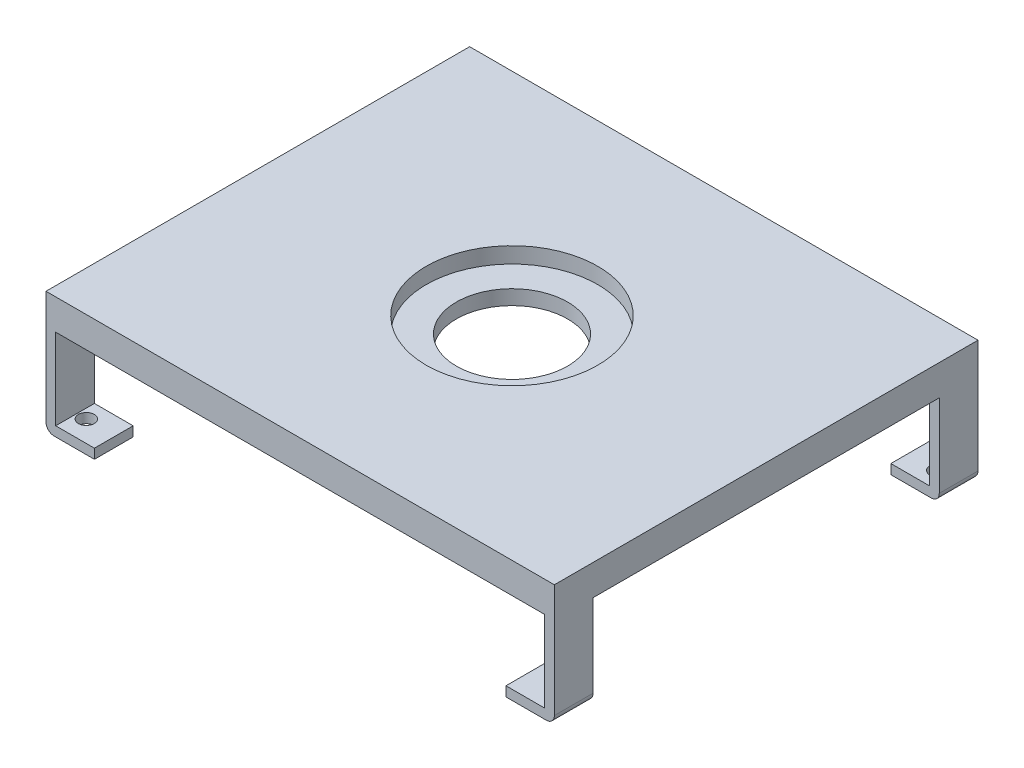
ISO-10303-21;
HEADER;
FILE_DESCRIPTION(('STEP AP214'),'2;1');
FILE_NAME('part.step','',(''),(''),'','','');
FILE_SCHEMA(('AUTOMOTIVE_DESIGN { 1 0 10303 214 1 1 1 1 }'));
ENDSEC;
DATA;
#1=APPLICATION_CONTEXT('core data for automotive mechanical design processes');
#2=APPLICATION_PROTOCOL_DEFINITION('international standard','automotive_design',2000,#1);
#3=PRODUCT_CONTEXT('',#1,'mechanical');
#4=PRODUCT('Part','Part','',(#3));
#5=PRODUCT_RELATED_PRODUCT_CATEGORY('part','',(#4));
#6=PRODUCT_DEFINITION_FORMATION('','',#4);
#7=PRODUCT_DEFINITION_CONTEXT('part definition',#1,'design');
#8=PRODUCT_DEFINITION('design','',#6,#7);
#9=PRODUCT_DEFINITION_SHAPE('','',#8);
#10=(LENGTH_UNIT() NAMED_UNIT(*) SI_UNIT(.MILLI.,.METRE.));
#11=(NAMED_UNIT(*) PLANE_ANGLE_UNIT() SI_UNIT($,.RADIAN.));
#12=(NAMED_UNIT(*) SI_UNIT($,.STERADIAN.) SOLID_ANGLE_UNIT());
#13=UNCERTAINTY_MEASURE_WITH_UNIT(LENGTH_MEASURE(1.E-05),#10,'distance_accuracy_value','');
#14=(GEOMETRIC_REPRESENTATION_CONTEXT(3) GLOBAL_UNCERTAINTY_ASSIGNED_CONTEXT((#13)) GLOBAL_UNIT_ASSIGNED_CONTEXT((#10,
#11,#12)) REPRESENTATION_CONTEXT('',''));
#15=CARTESIAN_POINT('',(0.,0.,0.));
#16=DIRECTION('',(0.,0.,1.));
#17=DIRECTION('',(1.,0.,0.));
#18=AXIS2_PLACEMENT_3D('',#15,#16,#17);
#19=CARTESIAN_POINT('',(0.,0.,66.675));
#20=DIRECTION('',(0.,1.,0.));
#21=DIRECTION('',(0.,0.,1.));
#22=AXIS2_PLACEMENT_3D('',#19,#20,#21);
#23=CYLINDRICAL_SURFACE('',#22,17.5);
#24=CARTESIAN_POINT('',(0.,28.58,66.675));
#25=DIRECTION('',(0.,1.,0.));
#26=DIRECTION('',(0.,0.,1.));
#27=AXIS2_PLACEMENT_3D('',#24,#25,#26);
#28=CIRCLE('',#27,17.5);
#29=CARTESIAN_POINT('',(0.,28.58,84.175));
#30=VERTEX_POINT('',#29);
#31=EDGE_CURVE('E248',#30,#30,#28,.T.);
#32=ORIENTED_EDGE('',*,*,#31,.F.);
#33=EDGE_LOOP('',(#32));
#34=FACE_BOUND('',#33,.T.);
#35=CARTESIAN_POINT('',(0.,33.2,66.675));
#36=DIRECTION('',(0.,1.,0.));
#37=DIRECTION('',(0.,0.,1.));
#38=AXIS2_PLACEMENT_3D('',#35,#36,#37);
#39=CIRCLE('',#38,17.5);
#40=CARTESIAN_POINT('',(0.,33.2,84.175));
#41=VERTEX_POINT('',#40);
#42=EDGE_CURVE('E944',#41,#41,#39,.T.);
#43=ORIENTED_EDGE('',*,*,#42,.T.);
#44=EDGE_LOOP('',(#43));
#45=FACE_BOUND('',#44,.T.);
#46=ADVANCED_FACE('F37',(#34,#45),#23,.F.);
#47=CARTESIAN_POINT('',(-64.77,3.048,133.35));
#48=DIRECTION('',(-1.,0.,0.));
#49=DIRECTION('',(0.,0.,1.));
#50=AXIS2_PLACEMENT_3D('',#47,#48,#49);
#51=PLANE('',#50);
#52=DIRECTION('',(0.,0.,-1.));
#53=VECTOR('',#52,1.);
#54=CARTESIAN_POINT('',(-64.77,3.048,133.35));
#55=LINE('',#54,#53);
#56=CARTESIAN_POINT('',(-64.77,3.048,12.192));
#57=VERTEX_POINT('',#56);
#58=CARTESIAN_POINT('',(-64.77,3.048,0.));
#59=VERTEX_POINT('',#58);
#60=EDGE_CURVE('E397',#57,#59,#55,.T.);
#61=ORIENTED_EDGE('',*,*,#60,.F.);
#62=DIRECTION('',(0.,-1.,0.));
#63=VECTOR('',#62,1.);
#64=CARTESIAN_POINT('',(-64.77,3.04800000000002,12.192));
#65=LINE('',#64,#63);
#66=CARTESIAN_POINT('',(-64.77,0.,12.192));
#67=VERTEX_POINT('',#66);
#68=EDGE_CURVE('E317',#57,#67,#65,.T.);
#69=ORIENTED_EDGE('',*,*,#68,.T.);
#70=DIRECTION('',(0.,0.,-1.));
#71=VECTOR('',#70,1.);
#72=CARTESIAN_POINT('',(-64.77,0.,133.35));
#73=LINE('',#72,#71);
#74=CARTESIAN_POINT('',(-64.77,0.,0.));
#75=VERTEX_POINT('',#74);
#76=EDGE_CURVE('E342',#67,#75,#73,.T.);
#77=ORIENTED_EDGE('',*,*,#76,.T.);
#78=DIRECTION('',(0.,1.,0.));
#79=VECTOR('',#78,1.);
#80=CARTESIAN_POINT('',(-64.77,3.048,0.));
#81=LINE('',#80,#79);
#82=EDGE_CURVE('E320',#75,#59,#81,.T.);
#83=ORIENTED_EDGE('',*,*,#82,.T.);
#84=EDGE_LOOP('',(#61,#69,#77,#83));
#85=FACE_BOUND('',#84,.T.);
#86=ADVANCED_FACE('F497',(#85),#51,.F.);
#87=CARTESIAN_POINT('',(-76.962,3.04799999999998,133.35));
#88=DIRECTION('',(0.,-1.,0.));
#89=DIRECTION('',(1.,0.,0.));
#90=AXIS2_PLACEMENT_3D('',#87,#88,#89);
#91=PLANE('',#90);
#92=CARTESIAN_POINT('',(-74.,3.04799999999999,6.67499999999998));
#93=DIRECTION('',(0.,-1.,0.));
#94=DIRECTION('',(1.,0.,0.));
#95=AXIS2_PLACEMENT_3D('',#92,#93,#94);
#96=CIRCLE('',#95,2.5);
#97=CARTESIAN_POINT('',(-71.5,3.04799999999999,6.67499999999998));
#98=VERTEX_POINT('',#97);
#99=EDGE_CURVE('E949',#98,#98,#96,.T.);
#100=ORIENTED_EDGE('',*,*,#99,.T.);
#101=EDGE_LOOP('',(#100));
#102=FACE_BOUND('',#101,.T.);
#103=DIRECTION('',(0.,0.,-1.));
#104=VECTOR('',#103,1.);
#105=CARTESIAN_POINT('',(-76.962,3.04799999999998,133.35));
#106=LINE('',#105,#104);
#107=CARTESIAN_POINT('',(-76.962,3.04799999999998,12.192));
#108=VERTEX_POINT('',#107);
#109=CARTESIAN_POINT('',(-76.962,3.04799999999998,0.));
#110=VERTEX_POINT('',#109);
#111=EDGE_CURVE('E393',#108,#110,#106,.T.);
#112=ORIENTED_EDGE('',*,*,#111,.F.);
#113=DIRECTION('',(1.,0.,0.));
#114=VECTOR('',#113,1.);
#115=CARTESIAN_POINT('',(-76.962,3.04799999999998,12.192));
#116=LINE('',#115,#114);
#117=EDGE_CURVE('E314',#108,#57,#116,.T.);
#118=ORIENTED_EDGE('',*,*,#117,.T.);
#119=ORIENTED_EDGE('',*,*,#60,.T.);
#120=DIRECTION('',(-1.,0.,0.));
#121=VECTOR('',#120,1.);
#122=CARTESIAN_POINT('',(-76.962,3.04799999999998,0.));
#123=LINE('',#122,#121);
#124=EDGE_CURVE('E345',#59,#110,#123,.T.);
#125=ORIENTED_EDGE('',*,*,#124,.T.);
#126=EDGE_LOOP('',(#112,#118,#119,#125));
#127=FACE_BOUND('',#126,.T.);
#128=ADVANCED_FACE('F503',(#102,#127),#91,.F.);
#129=CARTESIAN_POINT('',(-76.962,28.58,133.35));
#130=DIRECTION('',(-1.,0.,0.));
#131=DIRECTION('',(0.,0.,1.));
#132=AXIS2_PLACEMENT_3D('',#129,#130,#131);
#133=PLANE('',#132);
#134=DIRECTION('',(0.,0.,-1.));
#135=VECTOR('',#134,1.);
#136=CARTESIAN_POINT('',(-76.962,28.58,133.35));
#137=LINE('',#136,#135);
#138=CARTESIAN_POINT('',(-76.962,28.58,12.192));
#139=VERTEX_POINT('',#138);
#140=CARTESIAN_POINT('',(-76.962,28.58,0.));
#141=VERTEX_POINT('',#140);
#142=EDGE_CURVE('E389',#139,#141,#137,.T.);
#143=ORIENTED_EDGE('',*,*,#142,.F.);
#144=DIRECTION('',(0.,-1.,0.));
#145=VECTOR('',#144,1.);
#146=CARTESIAN_POINT('',(-76.962,28.58,12.192));
#147=LINE('',#146,#145);
#148=EDGE_CURVE('E311',#139,#108,#147,.T.);
#149=ORIENTED_EDGE('',*,*,#148,.T.);
#150=ORIENTED_EDGE('',*,*,#111,.T.);
#151=DIRECTION('',(0.,1.,0.));
#152=VECTOR('',#151,1.);
#153=CARTESIAN_POINT('',(-76.962,28.58,0.));
#154=LINE('',#153,#152);
#155=EDGE_CURVE('E348',#110,#141,#154,.T.);
#156=ORIENTED_EDGE('',*,*,#155,.T.);
#157=EDGE_LOOP('',(#143,#149,#150,#156));
#158=FACE_BOUND('',#157,.T.);
#159=ADVANCED_FACE('F555',(#158),#133,.F.);
#160=CARTESIAN_POINT('',(76.962,3.04799999999998,133.35));
#161=DIRECTION('',(1.,0.,0.));
#162=DIRECTION('',(0.,0.,-1.));
#163=AXIS2_PLACEMENT_3D('',#160,#161,#162);
#164=PLANE('',#163);
#165=DIRECTION('',(0.,0.,-1.));
#166=VECTOR('',#165,1.);
#167=CARTESIAN_POINT('',(76.962,3.04799999999998,133.35));
#168=LINE('',#167,#166);
#169=CARTESIAN_POINT('',(76.962,3.04799999999998,12.192));
#170=VERTEX_POINT('',#169);
#171=CARTESIAN_POINT('',(76.962,3.04799999999998,0.));
#172=VERTEX_POINT('',#171);
#173=EDGE_CURVE('E381',#170,#172,#168,.T.);
#174=ORIENTED_EDGE('',*,*,#173,.F.);
#175=DIRECTION('',(0.,1.,0.));
#176=VECTOR('',#175,1.);
#177=CARTESIAN_POINT('',(76.962,3.048,12.192));
#178=LINE('',#177,#176);
#179=CARTESIAN_POINT('',(76.962,28.58,12.192));
#180=VERTEX_POINT('',#179);
#181=EDGE_CURVE('E308',#170,#180,#178,.T.);
#182=ORIENTED_EDGE('',*,*,#181,.T.);
#183=DIRECTION('',(0.,0.,-1.));
#184=VECTOR('',#183,1.);
#185=CARTESIAN_POINT('',(76.962,28.58,133.35));
#186=LINE('',#185,#184);
#187=CARTESIAN_POINT('',(76.962,28.58,0.));
#188=VERTEX_POINT('',#187);
#189=EDGE_CURVE('E385',#180,#188,#186,.T.);
#190=ORIENTED_EDGE('',*,*,#189,.T.);
#191=DIRECTION('',(0.,-1.,0.));
#192=VECTOR('',#191,1.);
#193=CARTESIAN_POINT('',(76.962,3.04799999999998,0.));
#194=LINE('',#193,#192);
#195=EDGE_CURVE('E354',#188,#172,#194,.T.);
#196=ORIENTED_EDGE('',*,*,#195,.T.);
#197=EDGE_LOOP('',(#174,#182,#190,#196));
#198=FACE_BOUND('',#197,.T.);
#199=ADVANCED_FACE('F549',(#198),#164,.F.);
#200=CARTESIAN_POINT('',(64.77,3.048,133.35));
#201=DIRECTION('',(0.,-1.,0.));
#202=DIRECTION('',(1.,0.,0.));
#203=AXIS2_PLACEMENT_3D('',#200,#201,#202);
#204=PLANE('',#203);
#205=CARTESIAN_POINT('',(74.,3.04799999999999,6.67499999999998));
#206=DIRECTION('',(0.,-1.,0.));
#207=DIRECTION('',(1.,0.,0.));
#208=AXIS2_PLACEMENT_3D('',#205,#206,#207);
#209=CIRCLE('',#208,2.5);
#210=CARTESIAN_POINT('',(76.5,3.04799999999998,6.67499999999998));
#211=VERTEX_POINT('',#210);
#212=EDGE_CURVE('E945',#211,#211,#209,.T.);
#213=ORIENTED_EDGE('',*,*,#212,.T.);
#214=EDGE_LOOP('',(#213));
#215=FACE_BOUND('',#214,.T.);
#216=DIRECTION('',(0.,0.,-1.));
#217=VECTOR('',#216,1.);
#218=CARTESIAN_POINT('',(64.77,3.048,133.35));
#219=LINE('',#218,#217);
#220=CARTESIAN_POINT('',(64.77,3.048,12.192));
#221=VERTEX_POINT('',#220);
#222=CARTESIAN_POINT('',(64.77,3.048,0.));
#223=VERTEX_POINT('',#222);
#224=EDGE_CURVE('E377',#221,#223,#219,.T.);
#225=ORIENTED_EDGE('',*,*,#224,.F.);
#226=DIRECTION('',(1.,0.,0.));
#227=VECTOR('',#226,1.);
#228=CARTESIAN_POINT('',(64.77,3.048,12.192));
#229=LINE('',#228,#227);
#230=EDGE_CURVE('E305',#221,#170,#229,.T.);
#231=ORIENTED_EDGE('',*,*,#230,.T.);
#232=ORIENTED_EDGE('',*,*,#173,.T.);
#233=DIRECTION('',(-1.,0.,0.));
#234=VECTOR('',#233,1.);
#235=CARTESIAN_POINT('',(64.77,3.048,0.));
#236=LINE('',#235,#234);
#237=EDGE_CURVE('E357',#172,#223,#236,.T.);
#238=ORIENTED_EDGE('',*,*,#237,.T.);
#239=EDGE_LOOP('',(#225,#231,#232,#238));
#240=FACE_BOUND('',#239,.T.);
#241=ADVANCED_FACE('F546',(#215,#240),#204,.F.);
#242=CARTESIAN_POINT('',(64.77,0.,133.35));
#243=DIRECTION('',(1.,0.,0.));
#244=DIRECTION('',(0.,0.,-1.));
#245=AXIS2_PLACEMENT_3D('',#242,#243,#244);
#246=PLANE('',#245);
#247=DIRECTION('',(0.,0.,-1.));
#248=VECTOR('',#247,1.);
#249=CARTESIAN_POINT('',(64.77,0.,133.35));
#250=LINE('',#249,#248);
#251=CARTESIAN_POINT('',(64.77,0.,12.192));
#252=VERTEX_POINT('',#251);
#253=CARTESIAN_POINT('',(64.77,0.,0.));
#254=VERTEX_POINT('',#253);
#255=EDGE_CURVE('E373',#252,#254,#250,.T.);
#256=ORIENTED_EDGE('',*,*,#255,.F.);
#257=DIRECTION('',(0.,1.,0.));
#258=VECTOR('',#257,1.);
#259=CARTESIAN_POINT('',(64.77,0.,12.192));
#260=LINE('',#259,#258);
#261=EDGE_CURVE('E302',#252,#221,#260,.T.);
#262=ORIENTED_EDGE('',*,*,#261,.T.);
#263=ORIENTED_EDGE('',*,*,#224,.T.);
#264=DIRECTION('',(0.,-1.,0.));
#265=VECTOR('',#264,1.);
#266=CARTESIAN_POINT('',(64.77,0.,0.));
#267=LINE('',#266,#265);
#268=EDGE_CURVE('E360',#223,#254,#267,.T.);
#269=ORIENTED_EDGE('',*,*,#268,.T.);
#270=EDGE_LOOP('',(#256,#262,#263,#269));
#271=FACE_BOUND('',#270,.T.);
#272=ADVANCED_FACE('F542',(#271),#246,.F.);
#273=CARTESIAN_POINT('',(80.01,0.,133.35));
#274=DIRECTION('',(0.,1.,0.));
#275=DIRECTION('',(-1.,0.,0.));
#276=AXIS2_PLACEMENT_3D('',#273,#274,#275);
#277=PLANE('',#276);
#278=CARTESIAN_POINT('',(74.,0.,6.67499999999998));
#279=DIRECTION('',(0.,-1.,0.));
#280=DIRECTION('',(1.,0.,0.));
#281=AXIS2_PLACEMENT_3D('',#278,#279,#280);
#282=CIRCLE('',#281,2.5);
#283=CARTESIAN_POINT('',(76.5,0.,6.67499999999998));
#284=VERTEX_POINT('',#283);
#285=EDGE_CURVE('E966',#284,#284,#282,.T.);
#286=ORIENTED_EDGE('',*,*,#285,.F.);
#287=EDGE_LOOP('',(#286));
#288=FACE_BOUND('',#287,.T.);
#289=DIRECTION('',(1.,0.,0.));
#290=VECTOR('',#289,1.);
#291=CARTESIAN_POINT('',(80.01,0.,0.));
#292=LINE('',#291,#290);
#293=CARTESIAN_POINT('',(77.47,0.,0.));
#294=VERTEX_POINT('',#293);
#295=EDGE_CURVE('E363',#254,#294,#292,.T.);
#296=ORIENTED_EDGE('',*,*,#295,.T.);
#297=DIRECTION('',(0.,0.,-1.));
#298=VECTOR('',#297,1.);
#299=CARTESIAN_POINT('',(77.47,0.,133.35));
#300=LINE('',#299,#298);
#301=CARTESIAN_POINT('',(77.47,0.,12.192));
#302=VERTEX_POINT('',#301);
#303=EDGE_CURVE('E45',#294,#302,#300,.F.);
#304=ORIENTED_EDGE('',*,*,#303,.T.);
#305=DIRECTION('',(-1.,0.,0.));
#306=VECTOR('',#305,1.);
#307=CARTESIAN_POINT('',(80.01,0.,12.192));
#308=LINE('',#307,#306);
#309=EDGE_CURVE('E267',#302,#252,#308,.T.);
#310=ORIENTED_EDGE('',*,*,#309,.T.);
#311=ORIENTED_EDGE('',*,*,#255,.T.);
#312=EDGE_LOOP('',(#296,#304,#310,#311));
#313=FACE_BOUND('',#312,.T.);
#314=ADVANCED_FACE('F537',(#288,#313),#277,.F.);
#315=CARTESIAN_POINT('',(-64.77,0.,133.35));
#316=DIRECTION('',(0.,1.,0.));
#317=DIRECTION('',(-1.,0.,0.));
#318=AXIS2_PLACEMENT_3D('',#315,#316,#317);
#319=PLANE('',#318);
#320=CARTESIAN_POINT('',(-74.,0.,6.67499999999998));
#321=DIRECTION('',(0.,-1.,0.));
#322=DIRECTION('',(1.,0.,0.));
#323=AXIS2_PLACEMENT_3D('',#320,#321,#322);
#324=CIRCLE('',#323,2.5);
#325=CARTESIAN_POINT('',(-71.5,0.,6.67499999999998));
#326=VERTEX_POINT('',#325);
#327=EDGE_CURVE('E570',#326,#326,#324,.T.);
#328=ORIENTED_EDGE('',*,*,#327,.F.);
#329=EDGE_LOOP('',(#328));
#330=FACE_BOUND('',#329,.T.);
#331=DIRECTION('',(-1.,0.,0.));
#332=VECTOR('',#331,1.);
#333=CARTESIAN_POINT('',(-64.77,0.,12.192));
#334=LINE('',#333,#332);
#335=CARTESIAN_POINT('',(-77.47,0.,12.192));
#336=VERTEX_POINT('',#335);
#337=EDGE_CURVE('E403',#67,#336,#334,.T.);
#338=ORIENTED_EDGE('',*,*,#337,.T.);
#339=DIRECTION('',(0.,0.,-1.));
#340=VECTOR('',#339,1.);
#341=CARTESIAN_POINT('',(-77.47,0.,133.35));
#342=LINE('',#341,#340);
#343=CARTESIAN_POINT('',(-77.47,0.,0.));
#344=VERTEX_POINT('',#343);
#345=EDGE_CURVE('E418',#336,#344,#342,.T.);
#346=ORIENTED_EDGE('',*,*,#345,.T.);
#347=DIRECTION('',(1.,0.,0.));
#348=VECTOR('',#347,1.);
#349=CARTESIAN_POINT('',(-64.77,0.,0.));
#350=LINE('',#349,#348);
#351=EDGE_CURVE('E325',#344,#75,#350,.T.);
#352=ORIENTED_EDGE('',*,*,#351,.T.);
#353=ORIENTED_EDGE('',*,*,#76,.F.);
#354=EDGE_LOOP('',(#338,#346,#352,#353));
#355=FACE_BOUND('',#354,.T.);
#356=ADVANCED_FACE('F528',(#330,#355),#319,.F.);
#357=CARTESIAN_POINT('',(-64.77,0.,133.35));
#358=VERTEX_POINT('',#357);
#359=CARTESIAN_POINT('',(-64.77,0.,121.158));
#360=VERTEX_POINT('',#359);
#361=EDGE_CURVE('E370',#358,#360,#73,.T.);
#362=ORIENTED_EDGE('',*,*,#361,.T.);
#363=DIRECTION('',(0.,1.,0.));
#364=VECTOR('',#363,1.);
#365=CARTESIAN_POINT('',(-64.77,3.048,121.158));
#366=LINE('',#365,#364);
#367=CARTESIAN_POINT('',(-64.77,3.048,121.158));
#368=VERTEX_POINT('',#367);
#369=EDGE_CURVE('E299',#360,#368,#366,.T.);
#370=ORIENTED_EDGE('',*,*,#369,.T.);
#371=CARTESIAN_POINT('',(-64.77,3.048,133.35));
#372=VERTEX_POINT('',#371);
#373=EDGE_CURVE('E398',#372,#368,#55,.T.);
#374=ORIENTED_EDGE('',*,*,#373,.F.);
#375=DIRECTION('',(0.,1.,0.));
#376=VECTOR('',#375,1.);
#377=CARTESIAN_POINT('',(-64.77,3.048,133.35));
#378=LINE('',#377,#376);
#379=EDGE_CURVE('E321',#358,#372,#378,.T.);
#380=ORIENTED_EDGE('',*,*,#379,.F.);
#381=EDGE_LOOP('',(#362,#370,#374,#380));
#382=FACE_BOUND('',#381,.T.);
#383=ADVANCED_FACE('F476',(#382),#51,.F.);
#384=CARTESIAN_POINT('',(-74.,3.04799999999999,126.675));
#385=DIRECTION('',(0.,-1.,0.));
#386=DIRECTION('',(1.,0.,0.));
#387=AXIS2_PLACEMENT_3D('',#384,#385,#386);
#388=CIRCLE('',#387,2.5);
#389=CARTESIAN_POINT('',(-71.5,3.04799999999999,126.675));
#390=VERTEX_POINT('',#389);
#391=EDGE_CURVE('E958',#390,#390,#388,.T.);
#392=ORIENTED_EDGE('',*,*,#391,.T.);
#393=EDGE_LOOP('',(#392));
#394=FACE_BOUND('',#393,.T.);
#395=ORIENTED_EDGE('',*,*,#373,.T.);
#396=DIRECTION('',(-1.,0.,0.));
#397=VECTOR('',#396,1.);
#398=CARTESIAN_POINT('',(-76.962,3.04799999999998,121.158));
#399=LINE('',#398,#397);
#400=CARTESIAN_POINT('',(-76.962,3.04799999999998,121.158));
#401=VERTEX_POINT('',#400);
#402=EDGE_CURVE('E296',#368,#401,#399,.T.);
#403=ORIENTED_EDGE('',*,*,#402,.T.);
#404=CARTESIAN_POINT('',(-76.962,3.04799999999998,133.35));
#405=VERTEX_POINT('',#404);
#406=EDGE_CURVE('E394',#405,#401,#106,.T.);
#407=ORIENTED_EDGE('',*,*,#406,.F.);
#408=DIRECTION('',(-1.,0.,0.));
#409=VECTOR('',#408,1.);
#410=CARTESIAN_POINT('',(-76.962,3.04799999999998,133.35));
#411=LINE('',#410,#409);
#412=EDGE_CURVE('E324',#372,#405,#411,.T.);
#413=ORIENTED_EDGE('',*,*,#412,.F.);
#414=EDGE_LOOP('',(#395,#403,#407,#413));
#415=FACE_BOUND('',#414,.T.);
#416=ADVANCED_FACE('F472',(#394,#415),#91,.F.);
#417=ORIENTED_EDGE('',*,*,#406,.T.);
#418=DIRECTION('',(0.,1.,0.));
#419=VECTOR('',#418,1.);
#420=CARTESIAN_POINT('',(-76.962,28.58,121.158));
#421=LINE('',#420,#419);
#422=CARTESIAN_POINT('',(-76.962,28.58,121.158));
#423=VERTEX_POINT('',#422);
#424=EDGE_CURVE('E293',#401,#423,#421,.T.);
#425=ORIENTED_EDGE('',*,*,#424,.T.);
#426=CARTESIAN_POINT('',(-76.962,28.58,133.35));
#427=VERTEX_POINT('',#426);
#428=EDGE_CURVE('E390',#427,#423,#137,.T.);
#429=ORIENTED_EDGE('',*,*,#428,.F.);
#430=DIRECTION('',(0.,1.,0.));
#431=VECTOR('',#430,1.);
#432=CARTESIAN_POINT('',(-76.962,28.58,133.35));
#433=LINE('',#432,#431);
#434=EDGE_CURVE('E327',#405,#427,#433,.T.);
#435=ORIENTED_EDGE('',*,*,#434,.F.);
#436=EDGE_LOOP('',(#417,#425,#429,#435));
#437=FACE_BOUND('',#436,.T.);
#438=ADVANCED_FACE('F465',(#437),#133,.F.);
#439=CARTESIAN_POINT('',(76.962,28.58,133.35));
#440=DIRECTION('',(0.,1.,0.));
#441=DIRECTION('',(0.,0.,1.));
#442=AXIS2_PLACEMENT_3D('',#439,#440,#441);
#443=PLANE('',#442);
#444=ORIENTED_EDGE('',*,*,#31,.T.);
#445=EDGE_LOOP('',(#444));
#446=FACE_BOUND('',#445,.T.);
#447=ORIENTED_EDGE('',*,*,#428,.T.);
#448=DIRECTION('',(-1.,0.,0.));
#449=VECTOR('',#448,1.);
#450=CARTESIAN_POINT('',(80.01,28.58,121.158));
#451=LINE('',#450,#449);
#452=CARTESIAN_POINT('',(-80.01,28.58,121.158));
#453=VERTEX_POINT('',#452);
#454=EDGE_CURVE('E281',#423,#453,#451,.T.);
#455=ORIENTED_EDGE('',*,*,#454,.T.);
#456=DIRECTION('',(0.,0.,-1.));
#457=VECTOR('',#456,1.);
#458=CARTESIAN_POINT('',(-80.01,28.58,12.192));
#459=LINE('',#458,#457);
#460=CARTESIAN_POINT('',(-80.01,28.58,12.192));
#461=VERTEX_POINT('',#460);
#462=EDGE_CURVE('E262',#453,#461,#459,.T.);
#463=ORIENTED_EDGE('',*,*,#462,.T.);
#464=DIRECTION('',(-1.,0.,0.));
#465=VECTOR('',#464,1.);
#466=CARTESIAN_POINT('',(80.01,28.58,12.192));
#467=LINE('',#466,#465);
#468=EDGE_CURVE('E277',#139,#461,#467,.T.);
#469=ORIENTED_EDGE('',*,*,#468,.F.);
#470=ORIENTED_EDGE('',*,*,#142,.T.);
#471=DIRECTION('',(1.,0.,0.));
#472=VECTOR('',#471,1.);
#473=CARTESIAN_POINT('',(76.962,28.58,0.));
#474=LINE('',#473,#472);
#475=EDGE_CURVE('E351',#141,#188,#474,.T.);
#476=ORIENTED_EDGE('',*,*,#475,.T.);
#477=ORIENTED_EDGE('',*,*,#189,.F.);
#478=CARTESIAN_POINT('',(80.01,28.58,12.192));
#479=VERTEX_POINT('',#478);
#480=EDGE_CURVE('E274',#479,#180,#467,.T.);
#481=ORIENTED_EDGE('',*,*,#480,.F.);
#482=DIRECTION('',(0.,0.,-1.));
#483=VECTOR('',#482,1.);
#484=CARTESIAN_POINT('',(80.01,28.58,12.192));
#485=LINE('',#484,#483);
#486=CARTESIAN_POINT('',(80.01,28.58,121.158));
#487=VERTEX_POINT('',#486);
#488=EDGE_CURVE('E264',#487,#479,#485,.T.);
#489=ORIENTED_EDGE('',*,*,#488,.F.);
#490=CARTESIAN_POINT('',(76.962,28.58,121.158));
#491=VERTEX_POINT('',#490);
#492=EDGE_CURVE('E278',#487,#491,#451,.T.);
#493=ORIENTED_EDGE('',*,*,#492,.T.);
#494=CARTESIAN_POINT('',(76.962,28.58,133.35));
#495=VERTEX_POINT('',#494);
#496=EDGE_CURVE('E386',#495,#491,#186,.T.);
#497=ORIENTED_EDGE('',*,*,#496,.F.);
#498=DIRECTION('',(1.,0.,0.));
#499=VECTOR('',#498,1.);
#500=CARTESIAN_POINT('',(76.962,28.58,133.35));
#501=LINE('',#500,#499);
#502=EDGE_CURVE('E329',#427,#495,#501,.T.);
#503=ORIENTED_EDGE('',*,*,#502,.F.);
#504=EDGE_LOOP('',(#447,#455,#463,#469,#470,#476,#477,#481,#489,#493,#497,#503));
#505=FACE_BOUND('',#504,.T.);
#506=ADVANCED_FACE('F452',(#446,#505),#443,.F.);
#507=ORIENTED_EDGE('',*,*,#496,.T.);
#508=DIRECTION('',(0.,-1.,0.));
#509=VECTOR('',#508,1.);
#510=CARTESIAN_POINT('',(76.962,3.04799999999998,121.158));
#511=LINE('',#510,#509);
#512=CARTESIAN_POINT('',(76.962,3.04799999999998,121.158));
#513=VERTEX_POINT('',#512);
#514=EDGE_CURVE('E290',#491,#513,#511,.T.);
#515=ORIENTED_EDGE('',*,*,#514,.T.);
#516=CARTESIAN_POINT('',(76.962,3.04799999999998,133.35));
#517=VERTEX_POINT('',#516);
#518=EDGE_CURVE('E382',#517,#513,#168,.T.);
#519=ORIENTED_EDGE('',*,*,#518,.F.);
#520=DIRECTION('',(0.,-1.,0.));
#521=VECTOR('',#520,1.);
#522=CARTESIAN_POINT('',(76.962,3.04799999999998,133.35));
#523=LINE('',#522,#521);
#524=EDGE_CURVE('E331',#495,#517,#523,.T.);
#525=ORIENTED_EDGE('',*,*,#524,.F.);
#526=EDGE_LOOP('',(#507,#515,#519,#525));
#527=FACE_BOUND('',#526,.T.);
#528=ADVANCED_FACE('F456',(#527),#164,.F.);
#529=CARTESIAN_POINT('',(74.,3.04799999999999,126.675));
#530=DIRECTION('',(0.,-1.,0.));
#531=DIRECTION('',(1.,0.,0.));
#532=AXIS2_PLACEMENT_3D('',#529,#530,#531);
#533=CIRCLE('',#532,2.5);
#534=CARTESIAN_POINT('',(76.5,3.04799999999998,126.675));
#535=VERTEX_POINT('',#534);
#536=EDGE_CURVE('E955',#535,#535,#533,.T.);
#537=ORIENTED_EDGE('',*,*,#536,.T.);
#538=EDGE_LOOP('',(#537));
#539=FACE_BOUND('',#538,.T.);
#540=ORIENTED_EDGE('',*,*,#518,.T.);
#541=DIRECTION('',(-1.,0.,0.));
#542=VECTOR('',#541,1.);
#543=CARTESIAN_POINT('',(64.77,3.048,121.158));
#544=LINE('',#543,#542);
#545=CARTESIAN_POINT('',(64.77,3.048,121.158));
#546=VERTEX_POINT('',#545);
#547=EDGE_CURVE('E287',#513,#546,#544,.T.);
#548=ORIENTED_EDGE('',*,*,#547,.T.);
#549=CARTESIAN_POINT('',(64.77,3.048,133.35));
#550=VERTEX_POINT('',#549);
#551=EDGE_CURVE('E378',#550,#546,#219,.T.);
#552=ORIENTED_EDGE('',*,*,#551,.F.);
#553=DIRECTION('',(-1.,0.,0.));
#554=VECTOR('',#553,1.);
#555=CARTESIAN_POINT('',(64.77,3.048,133.35));
#556=LINE('',#555,#554);
#557=EDGE_CURVE('E333',#517,#550,#556,.T.);
#558=ORIENTED_EDGE('',*,*,#557,.F.);
#559=EDGE_LOOP('',(#540,#548,#552,#558));
#560=FACE_BOUND('',#559,.T.);
#561=ADVANCED_FACE('F540',(#539,#560),#204,.F.);
#562=ORIENTED_EDGE('',*,*,#551,.T.);
#563=DIRECTION('',(0.,-1.,0.));
#564=VECTOR('',#563,1.);
#565=CARTESIAN_POINT('',(64.77,0.,121.158));
#566=LINE('',#565,#564);
#567=CARTESIAN_POINT('',(64.77,0.,121.158));
#568=VERTEX_POINT('',#567);
#569=EDGE_CURVE('E276',#546,#568,#566,.T.);
#570=ORIENTED_EDGE('',*,*,#569,.T.);
#571=CARTESIAN_POINT('',(64.77,0.,133.35));
#572=VERTEX_POINT('',#571);
#573=EDGE_CURVE('E374',#572,#568,#250,.T.);
#574=ORIENTED_EDGE('',*,*,#573,.F.);
#575=DIRECTION('',(0.,-1.,0.));
#576=VECTOR('',#575,1.);
#577=CARTESIAN_POINT('',(64.77,0.,133.35));
#578=LINE('',#577,#576);
#579=EDGE_CURVE('E335',#550,#572,#578,.T.);
#580=ORIENTED_EDGE('',*,*,#579,.F.);
#581=EDGE_LOOP('',(#562,#570,#574,#580));
#582=FACE_BOUND('',#581,.T.);
#583=ADVANCED_FACE('F535',(#582),#246,.F.);
#584=CARTESIAN_POINT('',(74.,0.,126.675));
#585=DIRECTION('',(0.,-1.,0.));
#586=DIRECTION('',(1.,0.,0.));
#587=AXIS2_PLACEMENT_3D('',#584,#585,#586);
#588=CIRCLE('',#587,2.5);
#589=CARTESIAN_POINT('',(76.5,0.,126.675));
#590=VERTEX_POINT('',#589);
#591=EDGE_CURVE('E964',#590,#590,#588,.T.);
#592=ORIENTED_EDGE('',*,*,#591,.F.);
#593=EDGE_LOOP('',(#592));
#594=FACE_BOUND('',#593,.T.);
#595=DIRECTION('',(-1.,0.,0.));
#596=VECTOR('',#595,1.);
#597=CARTESIAN_POINT('',(80.01,0.,121.158));
#598=LINE('',#597,#596);
#599=CARTESIAN_POINT('',(77.47,0.,121.158));
#600=VERTEX_POINT('',#599);
#601=EDGE_CURVE('E282',#600,#568,#598,.T.);
#602=ORIENTED_EDGE('',*,*,#601,.F.);
#603=DIRECTION('',(0.,0.,-1.));
#604=VECTOR('',#603,1.);
#605=CARTESIAN_POINT('',(77.47,0.,133.35));
#606=LINE('',#605,#604);
#607=CARTESIAN_POINT('',(77.47,0.,133.35));
#608=VERTEX_POINT('',#607);
#609=EDGE_CURVE('E434',#600,#608,#606,.F.);
#610=ORIENTED_EDGE('',*,*,#609,.T.);
#611=DIRECTION('',(1.,0.,0.));
#612=VECTOR('',#611,1.);
#613=CARTESIAN_POINT('',(80.01,0.,133.35));
#614=LINE('',#613,#612);
#615=EDGE_CURVE('E337',#572,#608,#614,.T.);
#616=ORIENTED_EDGE('',*,*,#615,.F.);
#617=ORIENTED_EDGE('',*,*,#573,.T.);
#618=EDGE_LOOP('',(#602,#610,#616,#617));
#619=FACE_BOUND('',#618,.T.);
#620=ADVANCED_FACE('F438',(#594,#619),#277,.F.);
#621=CARTESIAN_POINT('',(80.01,36.2,133.35));
#622=DIRECTION('',(-1.,0.,0.));
#623=DIRECTION('',(0.,0.,1.));
#624=AXIS2_PLACEMENT_3D('',#621,#622,#623);
#625=PLANE('',#624);
#626=DIRECTION('',(0.,1.,0.));
#627=VECTOR('',#626,1.);
#628=CARTESIAN_POINT('',(80.01,36.2,133.35));
#629=LINE('',#628,#627);
#630=CARTESIAN_POINT('',(80.01,2.54,133.35));
#631=VERTEX_POINT('',#630);
#632=CARTESIAN_POINT('',(80.01,38.2,133.35));
#633=VERTEX_POINT('',#632);
#634=EDGE_CURVE('E233',#631,#633,#629,.T.);
#635=ORIENTED_EDGE('',*,*,#634,.F.);
#636=DIRECTION('',(0.,0.,-1.));
#637=VECTOR('',#636,1.);
#638=CARTESIAN_POINT('',(80.01,2.54,133.35));
#639=LINE('',#638,#637);
#640=CARTESIAN_POINT('',(80.01,2.54,121.158));
#641=VERTEX_POINT('',#640);
#642=EDGE_CURVE('E430',#631,#641,#639,.T.);
#643=ORIENTED_EDGE('',*,*,#642,.T.);
#644=DIRECTION('',(0.,1.,0.));
#645=VECTOR('',#644,1.);
#646=CARTESIAN_POINT('',(80.01,0.,121.158));
#647=LINE('',#646,#645);
#648=EDGE_CURVE('E261',#641,#487,#647,.T.);
#649=ORIENTED_EDGE('',*,*,#648,.T.);
#650=ORIENTED_EDGE('',*,*,#488,.T.);
#651=DIRECTION('',(0.,-1.,0.));
#652=VECTOR('',#651,1.);
#653=CARTESIAN_POINT('',(80.01,0.,12.192));
#654=LINE('',#653,#652);
#655=CARTESIAN_POINT('',(80.01,2.54,12.192));
#656=VERTEX_POINT('',#655);
#657=EDGE_CURVE('E258',#479,#656,#654,.T.);
#658=ORIENTED_EDGE('',*,*,#657,.T.);
#659=DIRECTION('',(0.,0.,-1.));
#660=VECTOR('',#659,1.);
#661=CARTESIAN_POINT('',(80.01,2.54,133.35));
#662=LINE('',#661,#660);
#663=CARTESIAN_POINT('',(80.01,2.54,0.));
#664=VERTEX_POINT('',#663);
#665=EDGE_CURVE('E427',#656,#664,#662,.T.);
#666=ORIENTED_EDGE('',*,*,#665,.T.);
#667=DIRECTION('',(0.,1.,0.));
#668=VECTOR('',#667,1.);
#669=CARTESIAN_POINT('',(80.01,36.2,0.));
#670=LINE('',#669,#668);
#671=CARTESIAN_POINT('',(80.01,38.2,0.));
#672=VERTEX_POINT('',#671);
#673=EDGE_CURVE('E365',#664,#672,#670,.T.);
#674=ORIENTED_EDGE('',*,*,#673,.T.);
#675=DIRECTION('',(0.,0.,-1.));
#676=VECTOR('',#675,1.);
#677=CARTESIAN_POINT('',(80.01,38.2,0.));
#678=LINE('',#677,#676);
#679=EDGE_CURVE('E242',#633,#672,#678,.T.);
#680=ORIENTED_EDGE('',*,*,#679,.F.);
#681=EDGE_LOOP('',(#635,#643,#649,#650,#658,#666,#674,#680));
#682=FACE_BOUND('',#681,.T.);
#683=ADVANCED_FACE('F446',(#682),#625,.F.);
#684=CARTESIAN_POINT('',(-80.01,0.,133.35));
#685=DIRECTION('',(1.,0.,0.));
#686=DIRECTION('',(0.,0.,-1.));
#687=AXIS2_PLACEMENT_3D('',#684,#685,#686);
#688=PLANE('',#687);
#689=DIRECTION('',(0.,1.,0.));
#690=VECTOR('',#689,1.);
#691=CARTESIAN_POINT('',(-80.01,0.,121.158));
#692=LINE('',#691,#690);
#693=CARTESIAN_POINT('',(-80.01,2.54,121.158));
#694=VERTEX_POINT('',#693);
#695=EDGE_CURVE('E270',#694,#453,#692,.T.);
#696=ORIENTED_EDGE('',*,*,#695,.F.);
#697=DIRECTION('',(0.,0.,-1.));
#698=VECTOR('',#697,1.);
#699=CARTESIAN_POINT('',(-80.01,2.54,133.35));
#700=LINE('',#699,#698);
#701=CARTESIAN_POINT('',(-80.01,2.54,133.35));
#702=VERTEX_POINT('',#701);
#703=EDGE_CURVE('E229',#694,#702,#700,.F.);
#704=ORIENTED_EDGE('',*,*,#703,.T.);
#705=DIRECTION('',(0.,-1.,0.));
#706=VECTOR('',#705,1.);
#707=CARTESIAN_POINT('',(-80.01,0.,133.35));
#708=LINE('',#707,#706);
#709=CARTESIAN_POINT('',(-80.01,38.2,133.35));
#710=VERTEX_POINT('',#709);
#711=EDGE_CURVE('E221',#710,#702,#708,.T.);
#712=ORIENTED_EDGE('',*,*,#711,.F.);
#713=DIRECTION('',(0.,0.,1.));
#714=VECTOR('',#713,1.);
#715=CARTESIAN_POINT('',(-80.01,38.2,0.));
#716=LINE('',#715,#714);
#717=CARTESIAN_POINT('',(-80.01,38.2,0.));
#718=VERTEX_POINT('',#717);
#719=EDGE_CURVE('E227',#718,#710,#716,.T.);
#720=ORIENTED_EDGE('',*,*,#719,.F.);
#721=DIRECTION('',(0.,-1.,0.));
#722=VECTOR('',#721,1.);
#723=CARTESIAN_POINT('',(-80.01,0.,0.));
#724=LINE('',#723,#722);
#725=CARTESIAN_POINT('',(-80.01,2.54,0.));
#726=VERTEX_POINT('',#725);
#727=EDGE_CURVE('E367',#718,#726,#724,.T.);
#728=ORIENTED_EDGE('',*,*,#727,.T.);
#729=DIRECTION('',(0.,0.,-1.));
#730=VECTOR('',#729,1.);
#731=CARTESIAN_POINT('',(-80.01,2.54,133.35));
#732=LINE('',#731,#730);
#733=CARTESIAN_POINT('',(-80.01,2.54,12.192));
#734=VERTEX_POINT('',#733);
#735=EDGE_CURVE('E411',#726,#734,#732,.F.);
#736=ORIENTED_EDGE('',*,*,#735,.T.);
#737=DIRECTION('',(0.,-1.,0.));
#738=VECTOR('',#737,1.);
#739=CARTESIAN_POINT('',(-80.01,0.,12.192));
#740=LINE('',#739,#738);
#741=EDGE_CURVE('E257',#461,#734,#740,.T.);
#742=ORIENTED_EDGE('',*,*,#741,.F.);
#743=ORIENTED_EDGE('',*,*,#462,.F.);
#744=EDGE_LOOP('',(#696,#704,#712,#720,#728,#736,#742,#743));
#745=FACE_BOUND('',#744,.T.);
#746=ADVANCED_FACE('F224',(#745),#688,.F.);
#747=CARTESIAN_POINT('',(-74.,0.,126.675));
#748=DIRECTION('',(0.,-1.,0.));
#749=DIRECTION('',(1.,0.,0.));
#750=AXIS2_PLACEMENT_3D('',#747,#748,#749);
#751=CIRCLE('',#750,2.5);
#752=CARTESIAN_POINT('',(-71.5,0.,126.675));
#753=VERTEX_POINT('',#752);
#754=EDGE_CURVE('E961',#753,#753,#751,.T.);
#755=ORIENTED_EDGE('',*,*,#754,.F.);
#756=EDGE_LOOP('',(#755));
#757=FACE_BOUND('',#756,.T.);
#758=DIRECTION('',(1.,0.,0.));
#759=VECTOR('',#758,1.);
#760=CARTESIAN_POINT('',(-64.77,0.,133.35));
#761=LINE('',#760,#759);
#762=CARTESIAN_POINT('',(-77.47,0.,133.35));
#763=VERTEX_POINT('',#762);
#764=EDGE_CURVE('E232',#763,#358,#761,.T.);
#765=ORIENTED_EDGE('',*,*,#764,.F.);
#766=DIRECTION('',(0.,0.,-1.));
#767=VECTOR('',#766,1.);
#768=CARTESIAN_POINT('',(-77.47,0.,133.35));
#769=LINE('',#768,#767);
#770=CARTESIAN_POINT('',(-77.47,0.,121.158));
#771=VERTEX_POINT('',#770);
#772=EDGE_CURVE('E406',#763,#771,#769,.T.);
#773=ORIENTED_EDGE('',*,*,#772,.T.);
#774=DIRECTION('',(1.,0.,0.));
#775=VECTOR('',#774,1.);
#776=CARTESIAN_POINT('',(-64.77,0.,121.158));
#777=LINE('',#776,#775);
#778=EDGE_CURVE('E401',#771,#360,#777,.T.);
#779=ORIENTED_EDGE('',*,*,#778,.T.);
#780=ORIENTED_EDGE('',*,*,#361,.F.);
#781=EDGE_LOOP('',(#765,#773,#779,#780));
#782=FACE_BOUND('',#781,.T.);
#783=ADVANCED_FACE('F480',(#757,#782),#319,.F.);
#784=CARTESIAN_POINT('',(0.,0.,133.35));
#785=DIRECTION('',(0.,0.,-1.));
#786=DIRECTION('',(-1.,0.,0.));
#787=AXIS2_PLACEMENT_3D('',#784,#785,#786);
#788=PLANE('',#787);
#789=ORIENTED_EDGE('',*,*,#711,.T.);
#790=CARTESIAN_POINT('',(-77.47,2.54,133.35));
#791=DIRECTION('',(0.,0.,-1.));
#792=DIRECTION('',(-1.,0.,0.));
#793=AXIS2_PLACEMENT_3D('',#790,#791,#792);
#794=CIRCLE('',#793,2.54);
#795=EDGE_CURVE('E416',#702,#763,#794,.F.);
#796=ORIENTED_EDGE('',*,*,#795,.T.);
#797=ORIENTED_EDGE('',*,*,#764,.T.);
#798=ORIENTED_EDGE('',*,*,#379,.T.);
#799=ORIENTED_EDGE('',*,*,#412,.T.);
#800=ORIENTED_EDGE('',*,*,#434,.T.);
#801=ORIENTED_EDGE('',*,*,#502,.T.);
#802=ORIENTED_EDGE('',*,*,#524,.T.);
#803=ORIENTED_EDGE('',*,*,#557,.T.);
#804=ORIENTED_EDGE('',*,*,#579,.T.);
#805=ORIENTED_EDGE('',*,*,#615,.T.);
#806=CARTESIAN_POINT('',(77.47,2.54,133.35));
#807=DIRECTION('',(0.,0.,-1.));
#808=DIRECTION('',(-1.,0.,0.));
#809=AXIS2_PLACEMENT_3D('',#806,#807,#808);
#810=CIRCLE('',#809,2.54);
#811=EDGE_CURVE('E414',#608,#631,#810,.F.);
#812=ORIENTED_EDGE('',*,*,#811,.T.);
#813=ORIENTED_EDGE('',*,*,#634,.T.);
#814=DIRECTION('',(1.,0.,0.));
#815=VECTOR('',#814,1.);
#816=CARTESIAN_POINT('',(-80.01,38.2,133.35));
#817=LINE('',#816,#815);
#818=EDGE_CURVE('E236',#710,#633,#817,.T.);
#819=ORIENTED_EDGE('',*,*,#818,.F.);
#820=EDGE_LOOP('',(#789,#796,#797,#798,#799,#800,#801,#802,#803,#804,#805,#812,#813,#819));
#821=FACE_BOUND('',#820,.T.);
#822=ADVANCED_FACE('F237',(#821),#788,.F.);
#823=CARTESIAN_POINT('',(0.,0.,0.));
#824=DIRECTION('',(0.,0.,-1.));
#825=DIRECTION('',(-1.,0.,0.));
#826=AXIS2_PLACEMENT_3D('',#823,#824,#825);
#827=PLANE('',#826);
#828=ORIENTED_EDGE('',*,*,#351,.F.);
#829=CARTESIAN_POINT('',(-77.47,2.54,0.));
#830=DIRECTION('',(0.,0.,-1.));
#831=DIRECTION('',(-1.,0.,0.));
#832=AXIS2_PLACEMENT_3D('',#829,#830,#831);
#833=CIRCLE('',#832,2.54);
#834=EDGE_CURVE('E423',#344,#726,#833,.T.);
#835=ORIENTED_EDGE('',*,*,#834,.T.);
#836=ORIENTED_EDGE('',*,*,#727,.F.);
#837=DIRECTION('',(-1.,0.,0.));
#838=VECTOR('',#837,1.);
#839=CARTESIAN_POINT('',(-80.01,38.2,0.));
#840=LINE('',#839,#838);
#841=EDGE_CURVE('E247',#672,#718,#840,.T.);
#842=ORIENTED_EDGE('',*,*,#841,.F.);
#843=ORIENTED_EDGE('',*,*,#673,.F.);
#844=CARTESIAN_POINT('',(77.47,2.54,0.));
#845=DIRECTION('',(0.,0.,-1.));
#846=DIRECTION('',(-1.,0.,0.));
#847=AXIS2_PLACEMENT_3D('',#844,#845,#846);
#848=CIRCLE('',#847,2.54);
#849=EDGE_CURVE('E421',#664,#294,#848,.T.);
#850=ORIENTED_EDGE('',*,*,#849,.T.);
#851=ORIENTED_EDGE('',*,*,#295,.F.);
#852=ORIENTED_EDGE('',*,*,#268,.F.);
#853=ORIENTED_EDGE('',*,*,#237,.F.);
#854=ORIENTED_EDGE('',*,*,#195,.F.);
#855=ORIENTED_EDGE('',*,*,#475,.F.);
#856=ORIENTED_EDGE('',*,*,#155,.F.);
#857=ORIENTED_EDGE('',*,*,#124,.F.);
#858=ORIENTED_EDGE('',*,*,#82,.F.);
#859=EDGE_LOOP('',(#828,#835,#836,#842,#843,#850,#851,#852,#853,#854,#855,#856,#857,#858));
#860=FACE_BOUND('',#859,.T.);
#861=ADVANCED_FACE('F518',(#860),#827,.T.);
#862=CARTESIAN_POINT('',(80.01,0.,12.192));
#863=DIRECTION('',(0.,0.,-1.));
#864=DIRECTION('',(0.,1.,0.));
#865=AXIS2_PLACEMENT_3D('',#862,#863,#864);
#866=PLANE('',#865);
#867=ORIENTED_EDGE('',*,*,#741,.T.);
#868=CARTESIAN_POINT('',(-77.47,2.54,12.192));
#869=DIRECTION('',(0.,0.,-1.));
#870=DIRECTION('',(0.,1.,0.));
#871=AXIS2_PLACEMENT_3D('',#868,#869,#870);
#872=CIRCLE('',#871,2.54);
#873=EDGE_CURVE('E425',#734,#336,#872,.F.);
#874=ORIENTED_EDGE('',*,*,#873,.T.);
#875=ORIENTED_EDGE('',*,*,#337,.F.);
#876=ORIENTED_EDGE('',*,*,#68,.F.);
#877=ORIENTED_EDGE('',*,*,#117,.F.);
#878=ORIENTED_EDGE('',*,*,#148,.F.);
#879=ORIENTED_EDGE('',*,*,#468,.T.);
#880=EDGE_LOOP('',(#867,#874,#875,#876,#877,#878,#879));
#881=FACE_BOUND('',#880,.T.);
#882=ADVANCED_FACE('F515',(#881),#866,.F.);
#883=CARTESIAN_POINT('',(80.01,0.,121.158));
#884=DIRECTION('',(0.,0.,1.));
#885=DIRECTION('',(1.,0.,0.));
#886=AXIS2_PLACEMENT_3D('',#883,#884,#885);
#887=PLANE('',#886);
#888=ORIENTED_EDGE('',*,*,#778,.F.);
#889=CARTESIAN_POINT('',(-77.47,2.54,121.158));
#890=DIRECTION('',(0.,0.,1.));
#891=DIRECTION('',(1.,0.,0.));
#892=AXIS2_PLACEMENT_3D('',#889,#890,#891);
#893=CIRCLE('',#892,2.54);
#894=EDGE_CURVE('E409',#771,#694,#893,.F.);
#895=ORIENTED_EDGE('',*,*,#894,.T.);
#896=ORIENTED_EDGE('',*,*,#695,.T.);
#897=ORIENTED_EDGE('',*,*,#454,.F.);
#898=ORIENTED_EDGE('',*,*,#424,.F.);
#899=ORIENTED_EDGE('',*,*,#402,.F.);
#900=ORIENTED_EDGE('',*,*,#369,.F.);
#901=EDGE_LOOP('',(#888,#895,#896,#897,#898,#899,#900));
#902=FACE_BOUND('',#901,.T.);
#903=ADVANCED_FACE('F469',(#902),#887,.F.);
#904=ORIENTED_EDGE('',*,*,#309,.F.);
#905=CARTESIAN_POINT('',(77.47,2.54,12.192));
#906=DIRECTION('',(0.,0.,-1.));
#907=DIRECTION('',(0.,1.,0.));
#908=AXIS2_PLACEMENT_3D('',#905,#906,#907);
#909=CIRCLE('',#908,2.54);
#910=EDGE_CURVE('E11',#302,#656,#909,.F.);
#911=ORIENTED_EDGE('',*,*,#910,.T.);
#912=ORIENTED_EDGE('',*,*,#657,.F.);
#913=ORIENTED_EDGE('',*,*,#480,.T.);
#914=ORIENTED_EDGE('',*,*,#181,.F.);
#915=ORIENTED_EDGE('',*,*,#230,.F.);
#916=ORIENTED_EDGE('',*,*,#261,.F.);
#917=EDGE_LOOP('',(#904,#911,#912,#913,#914,#915,#916));
#918=FACE_BOUND('',#917,.T.);
#919=ADVANCED_FACE('F493',(#918),#866,.F.);
#920=ORIENTED_EDGE('',*,*,#648,.F.);
#921=CARTESIAN_POINT('',(77.47,2.54,121.158));
#922=DIRECTION('',(0.,0.,1.));
#923=DIRECTION('',(1.,0.,0.));
#924=AXIS2_PLACEMENT_3D('',#921,#922,#923);
#925=CIRCLE('',#924,2.54);
#926=EDGE_CURVE('E59',#641,#600,#925,.F.);
#927=ORIENTED_EDGE('',*,*,#926,.T.);
#928=ORIENTED_EDGE('',*,*,#601,.T.);
#929=ORIENTED_EDGE('',*,*,#569,.F.);
#930=ORIENTED_EDGE('',*,*,#547,.F.);
#931=ORIENTED_EDGE('',*,*,#514,.F.);
#932=ORIENTED_EDGE('',*,*,#492,.F.);
#933=EDGE_LOOP('',(#920,#927,#928,#929,#930,#931,#932));
#934=FACE_BOUND('',#933,.T.);
#935=ADVANCED_FACE('F449',(#934),#887,.F.);
#936=CARTESIAN_POINT('',(-77.47,2.54,133.35));
#937=DIRECTION('',(0.,0.,-1.));
#938=DIRECTION('',(-1.,0.,0.));
#939=AXIS2_PLACEMENT_3D('',#936,#937,#938);
#940=CYLINDRICAL_SURFACE('',#939,2.54);
#941=ORIENTED_EDGE('',*,*,#795,.F.);
#942=ORIENTED_EDGE('',*,*,#703,.F.);
#943=ORIENTED_EDGE('',*,*,#894,.F.);
#944=ORIENTED_EDGE('',*,*,#772,.F.);
#945=EDGE_LOOP('',(#941,#942,#943,#944));
#946=FACE_BOUND('',#945,.T.);
#947=ADVANCED_FACE('F483',(#946),#940,.T.);
#948=CARTESIAN_POINT('',(-77.47,2.54,133.35));
#949=DIRECTION('',(0.,0.,-1.));
#950=DIRECTION('',(-1.,0.,0.));
#951=AXIS2_PLACEMENT_3D('',#948,#949,#950);
#952=CYLINDRICAL_SURFACE('',#951,2.54);
#953=ORIENTED_EDGE('',*,*,#873,.F.);
#954=ORIENTED_EDGE('',*,*,#735,.F.);
#955=ORIENTED_EDGE('',*,*,#834,.F.);
#956=ORIENTED_EDGE('',*,*,#345,.F.);
#957=EDGE_LOOP('',(#953,#954,#955,#956));
#958=FACE_BOUND('',#957,.T.);
#959=ADVANCED_FACE('F485',(#958),#952,.T.);
#960=CARTESIAN_POINT('',(77.47,2.54,133.35));
#961=DIRECTION('',(0.,0.,-1.));
#962=DIRECTION('',(-1.,0.,0.));
#963=AXIS2_PLACEMENT_3D('',#960,#961,#962);
#964=CYLINDRICAL_SURFACE('',#963,2.54);
#965=ORIENTED_EDGE('',*,*,#811,.F.);
#966=ORIENTED_EDGE('',*,*,#609,.F.);
#967=ORIENTED_EDGE('',*,*,#926,.F.);
#968=ORIENTED_EDGE('',*,*,#642,.F.);
#969=EDGE_LOOP('',(#965,#966,#967,#968));
#970=FACE_BOUND('',#969,.T.);
#971=ADVANCED_FACE('F444',(#970),#964,.T.);
#972=CARTESIAN_POINT('',(77.47,2.54,133.35));
#973=DIRECTION('',(0.,0.,-1.));
#974=DIRECTION('',(-1.,0.,0.));
#975=AXIS2_PLACEMENT_3D('',#972,#973,#974);
#976=CYLINDRICAL_SURFACE('',#975,2.54);
#977=ORIENTED_EDGE('',*,*,#910,.F.);
#978=ORIENTED_EDGE('',*,*,#303,.F.);
#979=ORIENTED_EDGE('',*,*,#849,.F.);
#980=ORIENTED_EDGE('',*,*,#665,.F.);
#981=EDGE_LOOP('',(#977,#978,#979,#980));
#982=FACE_BOUND('',#981,.T.);
#983=ADVANCED_FACE('F39',(#982),#976,.T.);
#984=CARTESIAN_POINT('',(0.,38.2,0.));
#985=DIRECTION('',(0.,1.,0.));
#986=DIRECTION('',(0.,0.,1.));
#987=AXIS2_PLACEMENT_3D('',#984,#985,#986);
#988=PLANE('',#987);
#989=CARTESIAN_POINT('',(0.,38.2,66.675));
#990=DIRECTION('',(0.,1.,0.));
#991=DIRECTION('',(0.,0.,1.));
#992=AXIS2_PLACEMENT_3D('',#989,#990,#991);
#993=CIRCLE('',#992,27.);
#994=CARTESIAN_POINT('',(0.,38.2,93.675));
#995=VERTEX_POINT('',#994);
#996=EDGE_CURVE('E943',#995,#995,#993,.T.);
#997=ORIENTED_EDGE('',*,*,#996,.F.);
#998=EDGE_LOOP('',(#997));
#999=FACE_BOUND('',#998,.T.);
#1000=ORIENTED_EDGE('',*,*,#719,.T.);
#1001=ORIENTED_EDGE('',*,*,#818,.T.);
#1002=ORIENTED_EDGE('',*,*,#679,.T.);
#1003=ORIENTED_EDGE('',*,*,#841,.T.);
#1004=EDGE_LOOP('',(#1000,#1001,#1002,#1003));
#1005=FACE_BOUND('',#1004,.T.);
#1006=ADVANCED_FACE('F245',(#999,#1005),#988,.T.);
#1007=CARTESIAN_POINT('',(0.,33.2,66.675));
#1008=DIRECTION('',(0.,1.,0.));
#1009=DIRECTION('',(0.,0.,1.));
#1010=AXIS2_PLACEMENT_3D('',#1007,#1008,#1009);
#1011=CYLINDRICAL_SURFACE('',#1010,27.);
#1012=CARTESIAN_POINT('',(0.,33.2,66.675));
#1013=DIRECTION('',(0.,1.,0.));
#1014=DIRECTION('',(0.,0.,1.));
#1015=AXIS2_PLACEMENT_3D('',#1012,#1013,#1014);
#1016=CIRCLE('',#1015,27.);
#1017=CARTESIAN_POINT('',(0.,33.2,93.675));
#1018=VERTEX_POINT('',#1017);
#1019=EDGE_CURVE('E251',#1018,#1018,#1016,.T.);
#1020=ORIENTED_EDGE('',*,*,#1019,.F.);
#1021=EDGE_LOOP('',(#1020));
#1022=FACE_BOUND('',#1021,.T.);
#1023=ORIENTED_EDGE('',*,*,#996,.T.);
#1024=EDGE_LOOP('',(#1023));
#1025=FACE_BOUND('',#1024,.T.);
#1026=ADVANCED_FACE('F509',(#1022,#1025),#1011,.F.);
#1027=CARTESIAN_POINT('',(0.,33.2,0.));
#1028=DIRECTION('',(0.,1.,0.));
#1029=DIRECTION('',(0.,0.,1.));
#1030=AXIS2_PLACEMENT_3D('',#1027,#1028,#1029);
#1031=PLANE('',#1030);
#1032=ORIENTED_EDGE('',*,*,#42,.F.);
#1033=EDGE_LOOP('',(#1032));
#1034=FACE_BOUND('',#1033,.T.);
#1035=ORIENTED_EDGE('',*,*,#1019,.T.);
#1036=EDGE_LOOP('',(#1035));
#1037=FACE_BOUND('',#1036,.T.);
#1038=ADVANCED_FACE('F724',(#1034,#1037),#1031,.T.);
#1039=CARTESIAN_POINT('',(-74.,4.99999999999999,126.675));
#1040=DIRECTION('',(0.,-1.,0.));
#1041=DIRECTION('',(1.,0.,0.));
#1042=AXIS2_PLACEMENT_3D('',#1039,#1040,#1041);
#1043=CYLINDRICAL_SURFACE('',#1042,2.5);
#1044=ORIENTED_EDGE('',*,*,#754,.T.);
#1045=EDGE_LOOP('',(#1044));
#1046=FACE_BOUND('',#1045,.T.);
#1047=ORIENTED_EDGE('',*,*,#391,.F.);
#1048=EDGE_LOOP('',(#1047));
#1049=FACE_BOUND('',#1048,.T.);
#1050=ADVANCED_FACE('F773',(#1046,#1049),#1043,.F.);
#1051=CARTESIAN_POINT('',(74.,5.00000000000001,126.675));
#1052=DIRECTION('',(0.,-1.,0.));
#1053=DIRECTION('',(1.,0.,0.));
#1054=AXIS2_PLACEMENT_3D('',#1051,#1052,#1053);
#1055=CYLINDRICAL_SURFACE('',#1054,2.5);
#1056=ORIENTED_EDGE('',*,*,#591,.T.);
#1057=EDGE_LOOP('',(#1056));
#1058=FACE_BOUND('',#1057,.T.);
#1059=ORIENTED_EDGE('',*,*,#536,.F.);
#1060=EDGE_LOOP('',(#1059));
#1061=FACE_BOUND('',#1060,.T.);
#1062=ADVANCED_FACE('F778',(#1058,#1061),#1055,.F.);
#1063=CARTESIAN_POINT('',(-74.,4.99999999999999,6.67499999999998));
#1064=DIRECTION('',(0.,-1.,0.));
#1065=DIRECTION('',(1.,0.,0.));
#1066=AXIS2_PLACEMENT_3D('',#1063,#1064,#1065);
#1067=CYLINDRICAL_SURFACE('',#1066,2.5);
#1068=ORIENTED_EDGE('',*,*,#327,.T.);
#1069=EDGE_LOOP('',(#1068));
#1070=FACE_BOUND('',#1069,.T.);
#1071=ORIENTED_EDGE('',*,*,#99,.F.);
#1072=EDGE_LOOP('',(#1071));
#1073=FACE_BOUND('',#1072,.T.);
#1074=ADVANCED_FACE('F789',(#1070,#1073),#1067,.F.);
#1075=CARTESIAN_POINT('',(74.,5.00000000000001,6.67499999999998));
#1076=DIRECTION('',(0.,-1.,0.));
#1077=DIRECTION('',(1.,0.,0.));
#1078=AXIS2_PLACEMENT_3D('',#1075,#1076,#1077);
#1079=CYLINDRICAL_SURFACE('',#1078,2.5);
#1080=ORIENTED_EDGE('',*,*,#285,.T.);
#1081=EDGE_LOOP('',(#1080));
#1082=FACE_BOUND('',#1081,.T.);
#1083=ORIENTED_EDGE('',*,*,#212,.F.);
#1084=EDGE_LOOP('',(#1083));
#1085=FACE_BOUND('',#1084,.T.);
#1086=ADVANCED_FACE('F800',(#1082,#1085),#1079,.F.);
#1087=CLOSED_SHELL('',(#46,#86,#128,#159,#199,#241,#272,#314,#356,#383,#416,#438,#506,#528,#561,
#583,#620,#683,#746,#783,#822,#861,#882,#903,#919,#935,#947,#959,#971,#983,#1006,#1026,#1038,
#1050,#1062,#1074,#1086));
#1088=MANIFOLD_SOLID_BREP('B2',#1087);
#1089=ADVANCED_BREP_SHAPE_REPRESENTATION('',(#18,#1088),#14);
#1090=SHAPE_DEFINITION_REPRESENTATION(#9,#1089);
ENDSEC;
END-ISO-10303-21;
